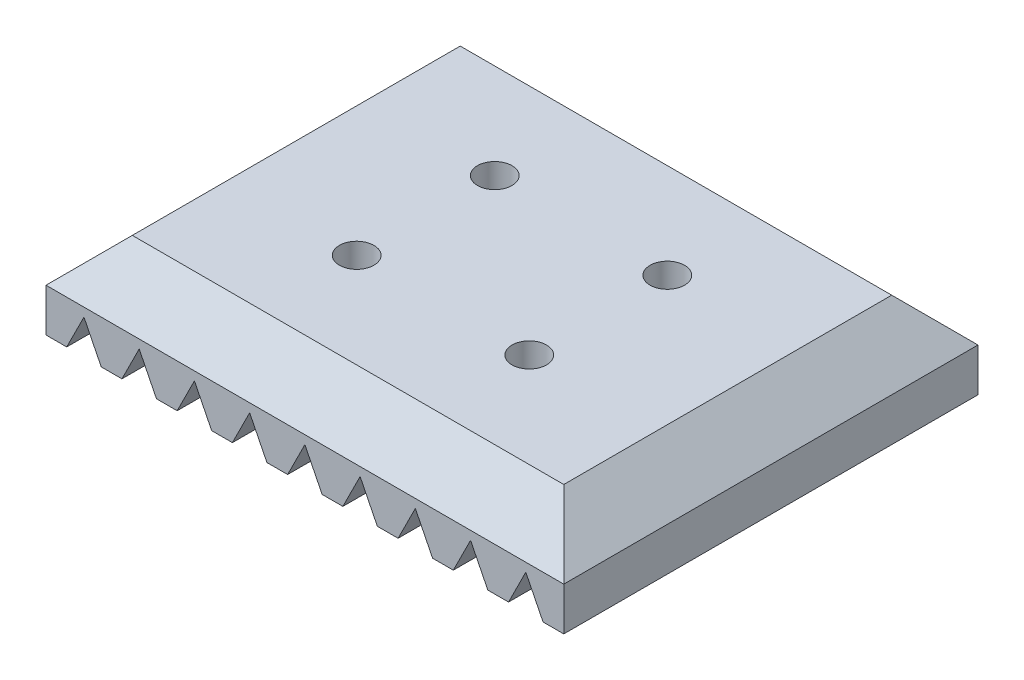
ISO-10303-21;
HEADER;
FILE_DESCRIPTION(('STEP AP214'),'2;1');
FILE_NAME('part.step','',(''),(''),'','','');
FILE_SCHEMA(('AUTOMOTIVE_DESIGN { 1 0 10303 214 1 1 1 1 }'));
ENDSEC;
DATA;
#1=APPLICATION_CONTEXT('core data for automotive mechanical design processes');
#2=APPLICATION_PROTOCOL_DEFINITION('international standard','automotive_design',2000,#1);
#3=PRODUCT_CONTEXT('',#1,'mechanical');
#4=PRODUCT('Part','Part','',(#3));
#5=PRODUCT_RELATED_PRODUCT_CATEGORY('part','',(#4));
#6=PRODUCT_DEFINITION_FORMATION('','',#4);
#7=PRODUCT_DEFINITION_CONTEXT('part definition',#1,'design');
#8=PRODUCT_DEFINITION('design','',#6,#7);
#9=PRODUCT_DEFINITION_SHAPE('','',#8);
#10=(LENGTH_UNIT() NAMED_UNIT(*) SI_UNIT(.MILLI.,.METRE.));
#11=(NAMED_UNIT(*) PLANE_ANGLE_UNIT() SI_UNIT($,.RADIAN.));
#12=(NAMED_UNIT(*) SI_UNIT($,.STERADIAN.) SOLID_ANGLE_UNIT());
#13=UNCERTAINTY_MEASURE_WITH_UNIT(LENGTH_MEASURE(1.E-05),#10,'distance_accuracy_value','');
#14=(GEOMETRIC_REPRESENTATION_CONTEXT(3) GLOBAL_UNCERTAINTY_ASSIGNED_CONTEXT((#13)) GLOBAL_UNIT_ASSIGNED_CONTEXT((#10,
#11,#12)) REPRESENTATION_CONTEXT('',''));
#15=CARTESIAN_POINT('',(0.,0.,0.));
#16=DIRECTION('',(0.,0.,1.));
#17=DIRECTION('',(1.,0.,0.));
#18=AXIS2_PLACEMENT_3D('',#15,#16,#17);
#19=CARTESIAN_POINT('',(0.,12.7,60.96));
#20=DIRECTION('',(0.,0.,-1.));
#21=DIRECTION('',(-1.,0.,0.));
#22=AXIS2_PLACEMENT_3D('',#19,#20,#21);
#23=PLANE('',#22);
#24=DIRECTION('',(0.447213595499958,0.894427190999916,0.));
#25=VECTOR('',#24,1.);
#26=CARTESIAN_POINT('',(68.072,0.,60.96));
#27=LINE('',#26,#25);
#28=CARTESIAN_POINT('',(68.072,0.,60.96));
#29=VERTEX_POINT('',#28);
#30=CARTESIAN_POINT('',(70.612,5.08,60.96));
#31=VERTEX_POINT('',#30);
#32=EDGE_CURVE('E264',#29,#31,#27,.T.);
#33=ORIENTED_EDGE('',*,*,#32,.T.);
#34=DIRECTION('',(0.447213595499958,-0.894427190999916,0.));
#35=VECTOR('',#34,1.);
#36=CARTESIAN_POINT('',(70.612,5.08,60.96));
#37=LINE('',#36,#35);
#38=CARTESIAN_POINT('',(73.152,0.,60.96));
#39=VERTEX_POINT('',#38);
#40=EDGE_CURVE('E251',#31,#39,#37,.T.);
#41=ORIENTED_EDGE('',*,*,#40,.T.);
#42=DIRECTION('',(1.,0.,0.));
#43=VECTOR('',#42,1.);
#44=CARTESIAN_POINT('',(0.,0.,60.96));
#45=LINE('',#44,#43);
#46=CARTESIAN_POINT('',(76.2,0.,60.96));
#47=VERTEX_POINT('',#46);
#48=EDGE_CURVE('E439',#39,#47,#45,.T.);
#49=ORIENTED_EDGE('',*,*,#48,.T.);
#50=DIRECTION('',(0.,-1.,0.));
#51=VECTOR('',#50,1.);
#52=CARTESIAN_POINT('',(76.2,12.7,60.96));
#53=LINE('',#52,#51);
#54=CARTESIAN_POINT('',(76.2,6.34999999999996,60.96));
#55=VERTEX_POINT('',#54);
#56=EDGE_CURVE('E456',#55,#47,#53,.T.);
#57=ORIENTED_EDGE('',*,*,#56,.F.);
#58=DIRECTION('',(-1.,0.,0.));
#59=VECTOR('',#58,1.);
#60=CARTESIAN_POINT('',(0.,6.34999999999996,60.96));
#61=LINE('',#60,#59);
#62=CARTESIAN_POINT('',(0.,6.34999999999996,60.96));
#63=VERTEX_POINT('',#62);
#64=EDGE_CURVE('E11',#55,#63,#61,.T.);
#65=ORIENTED_EDGE('',*,*,#64,.T.);
#66=DIRECTION('',(0.,-1.,0.));
#67=VECTOR('',#66,1.);
#68=CARTESIAN_POINT('',(0.,12.7,60.96));
#69=LINE('',#68,#67);
#70=CARTESIAN_POINT('',(0.,0.,60.96));
#71=VERTEX_POINT('',#70);
#72=EDGE_CURVE('E459',#63,#71,#69,.T.);
#73=ORIENTED_EDGE('',*,*,#72,.T.);
#74=CARTESIAN_POINT('',(3.04800000000001,0.,60.96));
#75=VERTEX_POINT('',#74);
#76=EDGE_CURVE('E440',#71,#75,#45,.T.);
#77=ORIENTED_EDGE('',*,*,#76,.T.);
#78=DIRECTION('',(0.447213595499958,0.894427190999916,0.));
#79=VECTOR('',#78,1.);
#80=CARTESIAN_POINT('',(3.04800000000001,0.,60.96));
#81=LINE('',#80,#79);
#82=CARTESIAN_POINT('',(5.58800000000001,5.08,60.96));
#83=VERTEX_POINT('',#82);
#84=EDGE_CURVE('E422',#75,#83,#81,.T.);
#85=ORIENTED_EDGE('',*,*,#84,.T.);
#86=DIRECTION('',(0.447213595499958,-0.894427190999916,0.));
#87=VECTOR('',#86,1.);
#88=CARTESIAN_POINT('',(5.58800000000001,5.08,60.96));
#89=LINE('',#88,#87);
#90=CARTESIAN_POINT('',(8.12800000000001,0.,60.96));
#91=VERTEX_POINT('',#90);
#92=EDGE_CURVE('E417',#83,#91,#89,.T.);
#93=ORIENTED_EDGE('',*,*,#92,.T.);
#94=CARTESIAN_POINT('',(11.176,0.,60.96));
#95=VERTEX_POINT('',#94);
#96=EDGE_CURVE('E444',#91,#95,#45,.T.);
#97=ORIENTED_EDGE('',*,*,#96,.T.);
#98=DIRECTION('',(0.447213595499958,0.894427190999916,0.));
#99=VECTOR('',#98,1.);
#100=CARTESIAN_POINT('',(11.176,0.,60.96));
#101=LINE('',#100,#99);
#102=CARTESIAN_POINT('',(13.716,5.08,60.96));
#103=VERTEX_POINT('',#102);
#104=EDGE_CURVE('E408',#95,#103,#101,.T.);
#105=ORIENTED_EDGE('',*,*,#104,.T.);
#106=DIRECTION('',(0.447213595499958,-0.894427190999916,0.));
#107=VECTOR('',#106,1.);
#108=CARTESIAN_POINT('',(13.716,5.08,60.96));
#109=LINE('',#108,#107);
#110=CARTESIAN_POINT('',(16.256,0.,60.96));
#111=VERTEX_POINT('',#110);
#112=EDGE_CURVE('E397',#103,#111,#109,.T.);
#113=ORIENTED_EDGE('',*,*,#112,.T.);
#114=CARTESIAN_POINT('',(19.304,0.,60.96));
#115=VERTEX_POINT('',#114);
#116=EDGE_CURVE('E977',#111,#115,#45,.T.);
#117=ORIENTED_EDGE('',*,*,#116,.T.);
#118=DIRECTION('',(0.447213595499958,0.894427190999916,0.));
#119=VECTOR('',#118,1.);
#120=CARTESIAN_POINT('',(19.304,0.,60.96));
#121=LINE('',#120,#119);
#122=CARTESIAN_POINT('',(21.844,5.08,60.96));
#123=VERTEX_POINT('',#122);
#124=EDGE_CURVE('E388',#115,#123,#121,.T.);
#125=ORIENTED_EDGE('',*,*,#124,.T.);
#126=DIRECTION('',(0.447213595499958,-0.894427190999916,0.));
#127=VECTOR('',#126,1.);
#128=CARTESIAN_POINT('',(21.844,5.08,60.96));
#129=LINE('',#128,#127);
#130=CARTESIAN_POINT('',(24.384,0.,60.96));
#131=VERTEX_POINT('',#130);
#132=EDGE_CURVE('E377',#123,#131,#129,.T.);
#133=ORIENTED_EDGE('',*,*,#132,.T.);
#134=CARTESIAN_POINT('',(27.432,0.,60.96));
#135=VERTEX_POINT('',#134);
#136=EDGE_CURVE('E979',#131,#135,#45,.T.);
#137=ORIENTED_EDGE('',*,*,#136,.T.);
#138=DIRECTION('',(0.447213595499958,0.894427190999916,0.));
#139=VECTOR('',#138,1.);
#140=CARTESIAN_POINT('',(27.432,0.,60.96));
#141=LINE('',#140,#139);
#142=CARTESIAN_POINT('',(29.972,5.08,60.96));
#143=VERTEX_POINT('',#142);
#144=EDGE_CURVE('E368',#135,#143,#141,.T.);
#145=ORIENTED_EDGE('',*,*,#144,.T.);
#146=DIRECTION('',(0.447213595499958,-0.894427190999916,0.));
#147=VECTOR('',#146,1.);
#148=CARTESIAN_POINT('',(29.972,5.08,60.96));
#149=LINE('',#148,#147);
#150=CARTESIAN_POINT('',(32.512,0.,60.96));
#151=VERTEX_POINT('',#150);
#152=EDGE_CURVE('E357',#143,#151,#149,.T.);
#153=ORIENTED_EDGE('',*,*,#152,.T.);
#154=CARTESIAN_POINT('',(35.56,0.,60.96));
#155=VERTEX_POINT('',#154);
#156=EDGE_CURVE('E982',#151,#155,#45,.T.);
#157=ORIENTED_EDGE('',*,*,#156,.T.);
#158=DIRECTION('',(0.447213595499958,0.894427190999916,0.));
#159=VECTOR('',#158,1.);
#160=CARTESIAN_POINT('',(35.56,0.,60.96));
#161=LINE('',#160,#159);
#162=CARTESIAN_POINT('',(38.1,5.08,60.96));
#163=VERTEX_POINT('',#162);
#164=EDGE_CURVE('E348',#155,#163,#161,.T.);
#165=ORIENTED_EDGE('',*,*,#164,.T.);
#166=DIRECTION('',(0.447213595499958,-0.894427190999916,0.));
#167=VECTOR('',#166,1.);
#168=CARTESIAN_POINT('',(38.1,5.08,60.96));
#169=LINE('',#168,#167);
#170=CARTESIAN_POINT('',(40.64,0.,60.96));
#171=VERTEX_POINT('',#170);
#172=EDGE_CURVE('E337',#163,#171,#169,.T.);
#173=ORIENTED_EDGE('',*,*,#172,.T.);
#174=CARTESIAN_POINT('',(43.688,0.,60.96));
#175=VERTEX_POINT('',#174);
#176=EDGE_CURVE('E542',#171,#175,#45,.T.);
#177=ORIENTED_EDGE('',*,*,#176,.T.);
#178=DIRECTION('',(0.447213595499958,0.894427190999916,0.));
#179=VECTOR('',#178,1.);
#180=CARTESIAN_POINT('',(43.688,0.,60.96));
#181=LINE('',#180,#179);
#182=CARTESIAN_POINT('',(46.228,5.08,60.96));
#183=VERTEX_POINT('',#182);
#184=EDGE_CURVE('E328',#175,#183,#181,.T.);
#185=ORIENTED_EDGE('',*,*,#184,.T.);
#186=DIRECTION('',(0.447213595499958,-0.894427190999916,0.));
#187=VECTOR('',#186,1.);
#188=CARTESIAN_POINT('',(46.228,5.08,60.96));
#189=LINE('',#188,#187);
#190=CARTESIAN_POINT('',(48.768,0.,60.96));
#191=VERTEX_POINT('',#190);
#192=EDGE_CURVE('E317',#183,#191,#189,.T.);
#193=ORIENTED_EDGE('',*,*,#192,.T.);
#194=CARTESIAN_POINT('',(51.816,0.,60.96));
#195=VERTEX_POINT('',#194);
#196=EDGE_CURVE('E540',#191,#195,#45,.T.);
#197=ORIENTED_EDGE('',*,*,#196,.T.);
#198=DIRECTION('',(0.447213595499958,0.894427190999916,0.));
#199=VECTOR('',#198,1.);
#200=CARTESIAN_POINT('',(51.816,0.,60.96));
#201=LINE('',#200,#199);
#202=CARTESIAN_POINT('',(54.356,5.08,60.96));
#203=VERTEX_POINT('',#202);
#204=EDGE_CURVE('E308',#195,#203,#201,.T.);
#205=ORIENTED_EDGE('',*,*,#204,.T.);
#206=DIRECTION('',(0.447213595499958,-0.894427190999916,0.));
#207=VECTOR('',#206,1.);
#208=CARTESIAN_POINT('',(54.356,5.08,60.96));
#209=LINE('',#208,#207);
#210=CARTESIAN_POINT('',(56.896,0.,60.96));
#211=VERTEX_POINT('',#210);
#212=EDGE_CURVE('E297',#203,#211,#209,.T.);
#213=ORIENTED_EDGE('',*,*,#212,.T.);
#214=CARTESIAN_POINT('',(59.944,0.,60.96));
#215=VERTEX_POINT('',#214);
#216=EDGE_CURVE('E539',#211,#215,#45,.T.);
#217=ORIENTED_EDGE('',*,*,#216,.T.);
#218=DIRECTION('',(0.447213595499958,0.894427190999916,0.));
#219=VECTOR('',#218,1.);
#220=CARTESIAN_POINT('',(59.944,0.,60.96));
#221=LINE('',#220,#219);
#222=CARTESIAN_POINT('',(62.484,5.08,60.96));
#223=VERTEX_POINT('',#222);
#224=EDGE_CURVE('E288',#215,#223,#221,.T.);
#225=ORIENTED_EDGE('',*,*,#224,.T.);
#226=DIRECTION('',(0.447213595499958,-0.894427190999916,0.));
#227=VECTOR('',#226,1.);
#228=CARTESIAN_POINT('',(62.484,5.08,60.96));
#229=LINE('',#228,#227);
#230=CARTESIAN_POINT('',(65.024,0.,60.96));
#231=VERTEX_POINT('',#230);
#232=EDGE_CURVE('E279',#223,#231,#229,.T.);
#233=ORIENTED_EDGE('',*,*,#232,.T.);
#234=EDGE_CURVE('E271',#231,#29,#45,.T.);
#235=ORIENTED_EDGE('',*,*,#234,.T.);
#236=EDGE_LOOP('',(#33,#41,#49,#57,#65,#73,#77,#85,#93,#97,#105,#113,#117,#125,#133,#137,#145,
#153,#157,#165,#173,#177,#185,#193,#197,#205,#213,#217,#225,#233,#235));
#237=FACE_BOUND('',#236,.T.);
#238=ADVANCED_FACE('F35',(#237),#23,.F.);
#239=CARTESIAN_POINT('',(0.,12.7,0.));
#240=DIRECTION('',(0.,0.,1.));
#241=DIRECTION('',(1.,0.,0.));
#242=AXIS2_PLACEMENT_3D('',#239,#240,#241);
#243=PLANE('',#242);
#244=DIRECTION('',(0.447213595499958,0.894427190999916,0.));
#245=VECTOR('',#244,1.);
#246=CARTESIAN_POINT('',(68.072,0.,0.));
#247=LINE('',#246,#245);
#248=CARTESIAN_POINT('',(68.072,0.,0.));
#249=VERTEX_POINT('',#248);
#250=CARTESIAN_POINT('',(70.612,5.08,0.));
#251=VERTEX_POINT('',#250);
#252=EDGE_CURVE('E266',#249,#251,#247,.T.);
#253=ORIENTED_EDGE('',*,*,#252,.F.);
#254=DIRECTION('',(-1.,0.,0.));
#255=VECTOR('',#254,1.);
#256=CARTESIAN_POINT('',(0.,0.,0.));
#257=LINE('',#256,#255);
#258=CARTESIAN_POINT('',(65.024,0.,0.));
#259=VERTEX_POINT('',#258);
#260=EDGE_CURVE('E60',#249,#259,#257,.T.);
#261=ORIENTED_EDGE('',*,*,#260,.T.);
#262=DIRECTION('',(0.447213595499958,-0.894427190999916,0.));
#263=VECTOR('',#262,1.);
#264=CARTESIAN_POINT('',(62.484,5.08,0.));
#265=LINE('',#264,#263);
#266=CARTESIAN_POINT('',(62.484,5.08,0.));
#267=VERTEX_POINT('',#266);
#268=EDGE_CURVE('E284',#267,#259,#265,.T.);
#269=ORIENTED_EDGE('',*,*,#268,.F.);
#270=DIRECTION('',(0.447213595499958,0.894427190999916,0.));
#271=VECTOR('',#270,1.);
#272=CARTESIAN_POINT('',(59.944,0.,0.));
#273=LINE('',#272,#271);
#274=CARTESIAN_POINT('',(59.944,0.,0.));
#275=VERTEX_POINT('',#274);
#276=EDGE_CURVE('E294',#275,#267,#273,.T.);
#277=ORIENTED_EDGE('',*,*,#276,.F.);
#278=CARTESIAN_POINT('',(56.896,0.,0.));
#279=VERTEX_POINT('',#278);
#280=EDGE_CURVE('E525',#275,#279,#257,.T.);
#281=ORIENTED_EDGE('',*,*,#280,.T.);
#282=DIRECTION('',(0.447213595499958,-0.894427190999916,0.));
#283=VECTOR('',#282,1.);
#284=CARTESIAN_POINT('',(54.356,5.08,0.));
#285=LINE('',#284,#283);
#286=CARTESIAN_POINT('',(54.356,5.08,0.));
#287=VERTEX_POINT('',#286);
#288=EDGE_CURVE('E303',#287,#279,#285,.T.);
#289=ORIENTED_EDGE('',*,*,#288,.F.);
#290=DIRECTION('',(0.447213595499958,0.894427190999916,0.));
#291=VECTOR('',#290,1.);
#292=CARTESIAN_POINT('',(51.816,0.,0.));
#293=LINE('',#292,#291);
#294=CARTESIAN_POINT('',(51.816,0.,0.));
#295=VERTEX_POINT('',#294);
#296=EDGE_CURVE('E314',#295,#287,#293,.T.);
#297=ORIENTED_EDGE('',*,*,#296,.F.);
#298=CARTESIAN_POINT('',(48.768,0.,0.));
#299=VERTEX_POINT('',#298);
#300=EDGE_CURVE('E521',#295,#299,#257,.T.);
#301=ORIENTED_EDGE('',*,*,#300,.T.);
#302=DIRECTION('',(0.447213595499958,-0.894427190999916,0.));
#303=VECTOR('',#302,1.);
#304=CARTESIAN_POINT('',(46.228,5.08,0.));
#305=LINE('',#304,#303);
#306=CARTESIAN_POINT('',(46.228,5.08,0.));
#307=VERTEX_POINT('',#306);
#308=EDGE_CURVE('E323',#307,#299,#305,.T.);
#309=ORIENTED_EDGE('',*,*,#308,.F.);
#310=DIRECTION('',(0.447213595499958,0.894427190999916,0.));
#311=VECTOR('',#310,1.);
#312=CARTESIAN_POINT('',(43.688,0.,0.));
#313=LINE('',#312,#311);
#314=CARTESIAN_POINT('',(43.688,0.,0.));
#315=VERTEX_POINT('',#314);
#316=EDGE_CURVE('E334',#315,#307,#313,.T.);
#317=ORIENTED_EDGE('',*,*,#316,.F.);
#318=CARTESIAN_POINT('',(40.64,0.,0.));
#319=VERTEX_POINT('',#318);
#320=EDGE_CURVE('E517',#315,#319,#257,.T.);
#321=ORIENTED_EDGE('',*,*,#320,.T.);
#322=DIRECTION('',(0.447213595499958,-0.894427190999916,0.));
#323=VECTOR('',#322,1.);
#324=CARTESIAN_POINT('',(38.1,5.08,0.));
#325=LINE('',#324,#323);
#326=CARTESIAN_POINT('',(38.1,5.08,0.));
#327=VERTEX_POINT('',#326);
#328=EDGE_CURVE('E343',#327,#319,#325,.T.);
#329=ORIENTED_EDGE('',*,*,#328,.F.);
#330=DIRECTION('',(0.447213595499958,0.894427190999916,0.));
#331=VECTOR('',#330,1.);
#332=CARTESIAN_POINT('',(35.56,0.,0.));
#333=LINE('',#332,#331);
#334=CARTESIAN_POINT('',(35.56,0.,0.));
#335=VERTEX_POINT('',#334);
#336=EDGE_CURVE('E354',#335,#327,#333,.T.);
#337=ORIENTED_EDGE('',*,*,#336,.F.);
#338=CARTESIAN_POINT('',(32.512,0.,0.));
#339=VERTEX_POINT('',#338);
#340=EDGE_CURVE('E513',#335,#339,#257,.T.);
#341=ORIENTED_EDGE('',*,*,#340,.T.);
#342=DIRECTION('',(0.447213595499958,-0.894427190999916,0.));
#343=VECTOR('',#342,1.);
#344=CARTESIAN_POINT('',(29.972,5.08,0.));
#345=LINE('',#344,#343);
#346=CARTESIAN_POINT('',(29.972,5.08,0.));
#347=VERTEX_POINT('',#346);
#348=EDGE_CURVE('E363',#347,#339,#345,.T.);
#349=ORIENTED_EDGE('',*,*,#348,.F.);
#350=DIRECTION('',(0.447213595499958,0.894427190999916,0.));
#351=VECTOR('',#350,1.);
#352=CARTESIAN_POINT('',(27.432,0.,0.));
#353=LINE('',#352,#351);
#354=CARTESIAN_POINT('',(27.432,0.,0.));
#355=VERTEX_POINT('',#354);
#356=EDGE_CURVE('E374',#355,#347,#353,.T.);
#357=ORIENTED_EDGE('',*,*,#356,.F.);
#358=CARTESIAN_POINT('',(24.384,0.,0.));
#359=VERTEX_POINT('',#358);
#360=EDGE_CURVE('E509',#355,#359,#257,.T.);
#361=ORIENTED_EDGE('',*,*,#360,.T.);
#362=DIRECTION('',(0.447213595499958,-0.894427190999916,0.));
#363=VECTOR('',#362,1.);
#364=CARTESIAN_POINT('',(21.844,5.08,0.));
#365=LINE('',#364,#363);
#366=CARTESIAN_POINT('',(21.844,5.08,0.));
#367=VERTEX_POINT('',#366);
#368=EDGE_CURVE('E383',#367,#359,#365,.T.);
#369=ORIENTED_EDGE('',*,*,#368,.F.);
#370=DIRECTION('',(0.447213595499958,0.894427190999916,0.));
#371=VECTOR('',#370,1.);
#372=CARTESIAN_POINT('',(19.304,0.,0.));
#373=LINE('',#372,#371);
#374=CARTESIAN_POINT('',(19.304,0.,0.));
#375=VERTEX_POINT('',#374);
#376=EDGE_CURVE('E394',#375,#367,#373,.T.);
#377=ORIENTED_EDGE('',*,*,#376,.F.);
#378=CARTESIAN_POINT('',(16.256,0.,0.));
#379=VERTEX_POINT('',#378);
#380=EDGE_CURVE('E506',#375,#379,#257,.T.);
#381=ORIENTED_EDGE('',*,*,#380,.T.);
#382=DIRECTION('',(0.447213595499958,-0.894427190999916,0.));
#383=VECTOR('',#382,1.);
#384=CARTESIAN_POINT('',(13.716,5.08,0.));
#385=LINE('',#384,#383);
#386=CARTESIAN_POINT('',(13.716,5.08,0.));
#387=VERTEX_POINT('',#386);
#388=EDGE_CURVE('E403',#387,#379,#385,.T.);
#389=ORIENTED_EDGE('',*,*,#388,.F.);
#390=DIRECTION('',(0.447213595499958,0.894427190999916,0.));
#391=VECTOR('',#390,1.);
#392=CARTESIAN_POINT('',(11.176,0.,0.));
#393=LINE('',#392,#391);
#394=CARTESIAN_POINT('',(11.176,0.,0.));
#395=VERTEX_POINT('',#394);
#396=EDGE_CURVE('E414',#395,#387,#393,.T.);
#397=ORIENTED_EDGE('',*,*,#396,.F.);
#398=CARTESIAN_POINT('',(8.128,0.,0.));
#399=VERTEX_POINT('',#398);
#400=EDGE_CURVE('E505',#395,#399,#257,.T.);
#401=ORIENTED_EDGE('',*,*,#400,.T.);
#402=DIRECTION('',(0.447213595499958,-0.894427190999916,0.));
#403=VECTOR('',#402,1.);
#404=CARTESIAN_POINT('',(5.58800000000001,5.08,0.));
#405=LINE('',#404,#403);
#406=CARTESIAN_POINT('',(5.58800000000001,5.08,0.));
#407=VERTEX_POINT('',#406);
#408=EDGE_CURVE('E418',#407,#399,#405,.T.);
#409=ORIENTED_EDGE('',*,*,#408,.F.);
#410=DIRECTION('',(0.447213595499958,0.894427190999916,0.));
#411=VECTOR('',#410,1.);
#412=CARTESIAN_POINT('',(3.04800000000001,0.,0.));
#413=LINE('',#412,#411);
#414=CARTESIAN_POINT('',(3.04800000000001,0.,0.));
#415=VERTEX_POINT('',#414);
#416=EDGE_CURVE('E421',#415,#407,#413,.T.);
#417=ORIENTED_EDGE('',*,*,#416,.F.);
#418=CARTESIAN_POINT('',(0.,0.,0.));
#419=VERTEX_POINT('',#418);
#420=EDGE_CURVE('E447',#415,#419,#257,.T.);
#421=ORIENTED_EDGE('',*,*,#420,.T.);
#422=DIRECTION('',(0.,-1.,0.));
#423=VECTOR('',#422,1.);
#424=CARTESIAN_POINT('',(0.,12.7,0.));
#425=LINE('',#424,#423);
#426=CARTESIAN_POINT('',(0.,6.34999999999996,0.));
#427=VERTEX_POINT('',#426);
#428=EDGE_CURVE('E451',#427,#419,#425,.T.);
#429=ORIENTED_EDGE('',*,*,#428,.F.);
#430=DIRECTION('',(1.,0.,0.));
#431=VECTOR('',#430,1.);
#432=CARTESIAN_POINT('',(76.2,6.34999999999996,0.));
#433=LINE('',#432,#431);
#434=CARTESIAN_POINT('',(76.2,6.34999999999996,0.));
#435=VERTEX_POINT('',#434);
#436=EDGE_CURVE('E473',#427,#435,#433,.T.);
#437=ORIENTED_EDGE('',*,*,#436,.T.);
#438=DIRECTION('',(0.,-1.,0.));
#439=VECTOR('',#438,1.);
#440=CARTESIAN_POINT('',(76.2,12.7,0.));
#441=LINE('',#440,#439);
#442=CARTESIAN_POINT('',(76.2,0.,0.));
#443=VERTEX_POINT('',#442);
#444=EDGE_CURVE('E454',#435,#443,#441,.T.);
#445=ORIENTED_EDGE('',*,*,#444,.T.);
#446=CARTESIAN_POINT('',(73.152,0.,0.));
#447=VERTEX_POINT('',#446);
#448=EDGE_CURVE('E448',#443,#447,#257,.T.);
#449=ORIENTED_EDGE('',*,*,#448,.T.);
#450=DIRECTION('',(0.447213595499958,-0.894427190999916,0.));
#451=VECTOR('',#450,1.);
#452=CARTESIAN_POINT('',(70.612,5.08,0.));
#453=LINE('',#452,#451);
#454=EDGE_CURVE('E52',#251,#447,#453,.T.);
#455=ORIENTED_EDGE('',*,*,#454,.F.);
#456=EDGE_LOOP('',(#253,#261,#269,#277,#281,#289,#297,#301,#309,#317,#321,#329,#337,#341,#349,
#357,#361,#369,#377,#381,#389,#397,#401,#409,#417,#421,#429,#437,#445,#449,#455));
#457=FACE_BOUND('',#456,.T.);
#458=ADVANCED_FACE('F499',(#457),#243,.F.);
#459=CARTESIAN_POINT('',(0.,0.,0.));
#460=DIRECTION('',(0.,1.,0.));
#461=DIRECTION('',(0.,0.,1.));
#462=AXIS2_PLACEMENT_3D('',#459,#460,#461);
#463=PLANE('',#462);
#464=DIRECTION('',(0.,0.,1.));
#465=VECTOR('',#464,1.);
#466=CARTESIAN_POINT('',(68.072,0.,0.));
#467=LINE('',#466,#465);
#468=EDGE_CURVE('E272',#249,#29,#467,.T.);
#469=ORIENTED_EDGE('',*,*,#468,.T.);
#470=ORIENTED_EDGE('',*,*,#234,.F.);
#471=DIRECTION('',(0.,0.,1.));
#472=VECTOR('',#471,1.);
#473=CARTESIAN_POINT('',(65.024,0.,0.));
#474=LINE('',#473,#472);
#475=EDGE_CURVE('E286',#259,#231,#474,.T.);
#476=ORIENTED_EDGE('',*,*,#475,.F.);
#477=ORIENTED_EDGE('',*,*,#260,.F.);
#478=EDGE_LOOP('',(#469,#470,#476,#477));
#479=FACE_BOUND('',#478,.T.);
#480=ADVANCED_FACE('F575',(#479),#463,.F.);
#481=DIRECTION('',(0.,0.,1.));
#482=VECTOR('',#481,1.);
#483=CARTESIAN_POINT('',(73.152,0.,0.));
#484=LINE('',#483,#482);
#485=EDGE_CURVE('E256',#447,#39,#484,.T.);
#486=ORIENTED_EDGE('',*,*,#485,.F.);
#487=ORIENTED_EDGE('',*,*,#448,.F.);
#488=DIRECTION('',(0.,0.,-1.));
#489=VECTOR('',#488,1.);
#490=CARTESIAN_POINT('',(76.2,0.,0.));
#491=LINE('',#490,#489);
#492=EDGE_CURVE('E443',#47,#443,#491,.T.);
#493=ORIENTED_EDGE('',*,*,#492,.F.);
#494=ORIENTED_EDGE('',*,*,#48,.F.);
#495=EDGE_LOOP('',(#486,#487,#493,#494));
#496=FACE_BOUND('',#495,.T.);
#497=ADVANCED_FACE('F550',(#496),#463,.F.);
#498=DIRECTION('',(0.,0.,1.));
#499=VECTOR('',#498,1.);
#500=CARTESIAN_POINT('',(59.944,0.,0.));
#501=LINE('',#500,#499);
#502=EDGE_CURVE('E291',#275,#215,#501,.T.);
#503=ORIENTED_EDGE('',*,*,#502,.T.);
#504=ORIENTED_EDGE('',*,*,#216,.F.);
#505=DIRECTION('',(0.,0.,1.));
#506=VECTOR('',#505,1.);
#507=CARTESIAN_POINT('',(56.896,0.,0.));
#508=LINE('',#507,#506);
#509=EDGE_CURVE('E306',#279,#211,#508,.T.);
#510=ORIENTED_EDGE('',*,*,#509,.F.);
#511=ORIENTED_EDGE('',*,*,#280,.F.);
#512=EDGE_LOOP('',(#503,#504,#510,#511));
#513=FACE_BOUND('',#512,.T.);
#514=ADVANCED_FACE('F537',(#513),#463,.F.);
#515=DIRECTION('',(0.,0.,1.));
#516=VECTOR('',#515,1.);
#517=CARTESIAN_POINT('',(51.816,0.,0.));
#518=LINE('',#517,#516);
#519=EDGE_CURVE('E311',#295,#195,#518,.T.);
#520=ORIENTED_EDGE('',*,*,#519,.T.);
#521=ORIENTED_EDGE('',*,*,#196,.F.);
#522=DIRECTION('',(0.,0.,1.));
#523=VECTOR('',#522,1.);
#524=CARTESIAN_POINT('',(48.768,0.,0.));
#525=LINE('',#524,#523);
#526=EDGE_CURVE('E326',#299,#191,#525,.T.);
#527=ORIENTED_EDGE('',*,*,#526,.F.);
#528=ORIENTED_EDGE('',*,*,#300,.F.);
#529=EDGE_LOOP('',(#520,#521,#527,#528));
#530=FACE_BOUND('',#529,.T.);
#531=ADVANCED_FACE('F878',(#530),#463,.F.);
#532=DIRECTION('',(0.,0.,1.));
#533=VECTOR('',#532,1.);
#534=CARTESIAN_POINT('',(43.688,0.,0.));
#535=LINE('',#534,#533);
#536=EDGE_CURVE('E331',#315,#175,#535,.T.);
#537=ORIENTED_EDGE('',*,*,#536,.T.);
#538=ORIENTED_EDGE('',*,*,#176,.F.);
#539=DIRECTION('',(0.,0.,1.));
#540=VECTOR('',#539,1.);
#541=CARTESIAN_POINT('',(40.64,0.,0.));
#542=LINE('',#541,#540);
#543=EDGE_CURVE('E346',#319,#171,#542,.T.);
#544=ORIENTED_EDGE('',*,*,#543,.F.);
#545=ORIENTED_EDGE('',*,*,#320,.F.);
#546=EDGE_LOOP('',(#537,#538,#544,#545));
#547=FACE_BOUND('',#546,.T.);
#548=ADVANCED_FACE('F885',(#547),#463,.F.);
#549=DIRECTION('',(0.,0.,1.));
#550=VECTOR('',#549,1.);
#551=CARTESIAN_POINT('',(35.56,0.,0.));
#552=LINE('',#551,#550);
#553=EDGE_CURVE('E351',#335,#155,#552,.T.);
#554=ORIENTED_EDGE('',*,*,#553,.T.);
#555=ORIENTED_EDGE('',*,*,#156,.F.);
#556=DIRECTION('',(0.,0.,1.));
#557=VECTOR('',#556,1.);
#558=CARTESIAN_POINT('',(32.512,0.,0.));
#559=LINE('',#558,#557);
#560=EDGE_CURVE('E366',#339,#151,#559,.T.);
#561=ORIENTED_EDGE('',*,*,#560,.F.);
#562=ORIENTED_EDGE('',*,*,#340,.F.);
#563=EDGE_LOOP('',(#554,#555,#561,#562));
#564=FACE_BOUND('',#563,.T.);
#565=ADVANCED_FACE('F893',(#564),#463,.F.);
#566=DIRECTION('',(0.,0.,1.));
#567=VECTOR('',#566,1.);
#568=CARTESIAN_POINT('',(27.432,0.,0.));
#569=LINE('',#568,#567);
#570=EDGE_CURVE('E371',#355,#135,#569,.T.);
#571=ORIENTED_EDGE('',*,*,#570,.T.);
#572=ORIENTED_EDGE('',*,*,#136,.F.);
#573=DIRECTION('',(0.,0.,1.));
#574=VECTOR('',#573,1.);
#575=CARTESIAN_POINT('',(24.384,0.,0.));
#576=LINE('',#575,#574);
#577=EDGE_CURVE('E386',#359,#131,#576,.T.);
#578=ORIENTED_EDGE('',*,*,#577,.F.);
#579=ORIENTED_EDGE('',*,*,#360,.F.);
#580=EDGE_LOOP('',(#571,#572,#578,#579));
#581=FACE_BOUND('',#580,.T.);
#582=ADVANCED_FACE('F901',(#581),#463,.F.);
#583=DIRECTION('',(0.,0.,1.));
#584=VECTOR('',#583,1.);
#585=CARTESIAN_POINT('',(19.304,0.,0.));
#586=LINE('',#585,#584);
#587=EDGE_CURVE('E391',#375,#115,#586,.T.);
#588=ORIENTED_EDGE('',*,*,#587,.T.);
#589=ORIENTED_EDGE('',*,*,#116,.F.);
#590=DIRECTION('',(0.,0.,1.));
#591=VECTOR('',#590,1.);
#592=CARTESIAN_POINT('',(16.256,0.,0.));
#593=LINE('',#592,#591);
#594=EDGE_CURVE('E406',#379,#111,#593,.T.);
#595=ORIENTED_EDGE('',*,*,#594,.F.);
#596=ORIENTED_EDGE('',*,*,#380,.F.);
#597=EDGE_LOOP('',(#588,#589,#595,#596));
#598=FACE_BOUND('',#597,.T.);
#599=ADVANCED_FACE('F909',(#598),#463,.F.);
#600=DIRECTION('',(0.,0.,1.));
#601=VECTOR('',#600,1.);
#602=CARTESIAN_POINT('',(11.176,0.,0.));
#603=LINE('',#602,#601);
#604=EDGE_CURVE('E411',#395,#95,#603,.T.);
#605=ORIENTED_EDGE('',*,*,#604,.T.);
#606=ORIENTED_EDGE('',*,*,#96,.F.);
#607=DIRECTION('',(0.,0.,1.));
#608=VECTOR('',#607,1.);
#609=CARTESIAN_POINT('',(8.12800000000001,0.,0.));
#610=LINE('',#609,#608);
#611=EDGE_CURVE('E424',#399,#91,#610,.T.);
#612=ORIENTED_EDGE('',*,*,#611,.F.);
#613=ORIENTED_EDGE('',*,*,#400,.F.);
#614=EDGE_LOOP('',(#605,#606,#612,#613));
#615=FACE_BOUND('',#614,.T.);
#616=ADVANCED_FACE('F917',(#615),#463,.F.);
#617=DIRECTION('',(0.,0.,1.));
#618=VECTOR('',#617,1.);
#619=CARTESIAN_POINT('',(3.04800000000001,0.,0.));
#620=LINE('',#619,#618);
#621=EDGE_CURVE('E429',#415,#75,#620,.T.);
#622=ORIENTED_EDGE('',*,*,#621,.T.);
#623=ORIENTED_EDGE('',*,*,#76,.F.);
#624=DIRECTION('',(0.,0.,1.));
#625=VECTOR('',#624,1.);
#626=CARTESIAN_POINT('',(0.,0.,0.));
#627=LINE('',#626,#625);
#628=EDGE_CURVE('E436',#419,#71,#627,.T.);
#629=ORIENTED_EDGE('',*,*,#628,.F.);
#630=ORIENTED_EDGE('',*,*,#420,.F.);
#631=EDGE_LOOP('',(#622,#623,#629,#630));
#632=FACE_BOUND('',#631,.T.);
#633=ADVANCED_FACE('F580',(#632),#463,.F.);
#634=CARTESIAN_POINT('',(0.,12.7,0.));
#635=DIRECTION('',(1.,0.,0.));
#636=DIRECTION('',(0.,0.,-1.));
#637=AXIS2_PLACEMENT_3D('',#634,#635,#636);
#638=PLANE('',#637);
#639=ORIENTED_EDGE('',*,*,#72,.F.);
#640=DIRECTION('',(0.,0.,-1.));
#641=VECTOR('',#640,1.);
#642=CARTESIAN_POINT('',(0.,6.34999999999996,0.));
#643=LINE('',#642,#641);
#644=EDGE_CURVE('E44',#63,#427,#643,.T.);
#645=ORIENTED_EDGE('',*,*,#644,.T.);
#646=ORIENTED_EDGE('',*,*,#428,.T.);
#647=ORIENTED_EDGE('',*,*,#628,.T.);
#648=EDGE_LOOP('',(#639,#645,#646,#647));
#649=FACE_BOUND('',#648,.T.);
#650=ADVANCED_FACE('F497',(#649),#638,.F.);
#651=CARTESIAN_POINT('',(76.2,12.7,0.));
#652=DIRECTION('',(-1.,0.,0.));
#653=DIRECTION('',(0.,0.,1.));
#654=AXIS2_PLACEMENT_3D('',#651,#652,#653);
#655=PLANE('',#654);
#656=ORIENTED_EDGE('',*,*,#444,.F.);
#657=DIRECTION('',(0.,0.,1.));
#658=VECTOR('',#657,1.);
#659=CARTESIAN_POINT('',(76.2,6.34999999999996,60.96));
#660=LINE('',#659,#658);
#661=EDGE_CURVE('E470',#435,#55,#660,.T.);
#662=ORIENTED_EDGE('',*,*,#661,.T.);
#663=ORIENTED_EDGE('',*,*,#56,.T.);
#664=ORIENTED_EDGE('',*,*,#492,.T.);
#665=EDGE_LOOP('',(#656,#662,#663,#664));
#666=FACE_BOUND('',#665,.T.);
#667=ADVANCED_FACE('F547',(#666),#655,.F.);
#668=CARTESIAN_POINT('',(0.,12.7,0.));
#669=DIRECTION('',(0.,1.,0.));
#670=DIRECTION('',(0.,0.,1.));
#671=AXIS2_PLACEMENT_3D('',#668,#669,#670);
#672=PLANE('',#671);
#673=CARTESIAN_POINT('',(50.8,12.7,40.64));
#674=DIRECTION('',(0.,1.,0.));
#675=DIRECTION('',(0.,0.,1.));
#676=AXIS2_PLACEMENT_3D('',#673,#674,#675);
#677=CIRCLE('',#676,2.54);
#678=CARTESIAN_POINT('',(50.8,12.7,43.18));
#679=VERTEX_POINT('',#678);
#680=EDGE_CURVE('E999',#679,#679,#677,.T.);
#681=ORIENTED_EDGE('',*,*,#680,.F.);
#682=EDGE_LOOP('',(#681));
#683=FACE_BOUND('',#682,.T.);
#684=CARTESIAN_POINT('',(25.4,12.7,40.64));
#685=DIRECTION('',(0.,1.,0.));
#686=DIRECTION('',(0.,0.,1.));
#687=AXIS2_PLACEMENT_3D('',#684,#685,#686);
#688=CIRCLE('',#687,2.54);
#689=CARTESIAN_POINT('',(25.4,12.7,43.18));
#690=VERTEX_POINT('',#689);
#691=EDGE_CURVE('E998',#690,#690,#688,.T.);
#692=ORIENTED_EDGE('',*,*,#691,.F.);
#693=EDGE_LOOP('',(#692));
#694=FACE_BOUND('',#693,.T.);
#695=CARTESIAN_POINT('',(50.8,12.7,20.32));
#696=DIRECTION('',(0.,1.,0.));
#697=DIRECTION('',(0.,0.,1.));
#698=AXIS2_PLACEMENT_3D('',#695,#696,#697);
#699=CIRCLE('',#698,2.54);
#700=CARTESIAN_POINT('',(50.8,12.7,22.86));
#701=VERTEX_POINT('',#700);
#702=EDGE_CURVE('E1008',#701,#701,#699,.T.);
#703=ORIENTED_EDGE('',*,*,#702,.F.);
#704=EDGE_LOOP('',(#703));
#705=FACE_BOUND('',#704,.T.);
#706=CARTESIAN_POINT('',(25.4,12.7,20.32));
#707=DIRECTION('',(0.,1.,0.));
#708=DIRECTION('',(0.,0.,1.));
#709=AXIS2_PLACEMENT_3D('',#706,#707,#708);
#710=CIRCLE('',#709,2.54);
#711=CARTESIAN_POINT('',(25.4,12.7,22.86));
#712=VERTEX_POINT('',#711);
#713=EDGE_CURVE('E1013',#712,#712,#710,.T.);
#714=ORIENTED_EDGE('',*,*,#713,.F.);
#715=EDGE_LOOP('',(#714));
#716=FACE_BOUND('',#715,.T.);
#717=DIRECTION('',(1.,0.,0.));
#718=VECTOR('',#717,1.);
#719=CARTESIAN_POINT('',(76.2,12.7,54.61));
#720=LINE('',#719,#718);
#721=CARTESIAN_POINT('',(6.35,12.7,54.61));
#722=VERTEX_POINT('',#721);
#723=CARTESIAN_POINT('',(69.85,12.7,54.61));
#724=VERTEX_POINT('',#723);
#725=EDGE_CURVE('E461',#722,#724,#720,.T.);
#726=ORIENTED_EDGE('',*,*,#725,.T.);
#727=DIRECTION('',(0.,0.,-1.));
#728=VECTOR('',#727,1.);
#729=CARTESIAN_POINT('',(69.85,12.7,0.));
#730=LINE('',#729,#728);
#731=CARTESIAN_POINT('',(69.85,12.7,6.34999999999999));
#732=VERTEX_POINT('',#731);
#733=EDGE_CURVE('E467',#724,#732,#730,.T.);
#734=ORIENTED_EDGE('',*,*,#733,.T.);
#735=DIRECTION('',(-1.,0.,0.));
#736=VECTOR('',#735,1.);
#737=CARTESIAN_POINT('',(0.,12.7,6.34999999999999));
#738=LINE('',#737,#736);
#739=CARTESIAN_POINT('',(6.35,12.7,6.34999999999999));
#740=VERTEX_POINT('',#739);
#741=EDGE_CURVE('E465',#732,#740,#738,.T.);
#742=ORIENTED_EDGE('',*,*,#741,.T.);
#743=DIRECTION('',(0.,0.,1.));
#744=VECTOR('',#743,1.);
#745=CARTESIAN_POINT('',(6.35,12.7,60.96));
#746=LINE('',#745,#744);
#747=EDGE_CURVE('E463',#740,#722,#746,.T.);
#748=ORIENTED_EDGE('',*,*,#747,.T.);
#749=EDGE_LOOP('',(#726,#734,#742,#748));
#750=FACE_BOUND('',#749,.T.);
#751=ADVANCED_FACE('F557',(#683,#694,#705,#716,#750),#672,.T.);
#752=CARTESIAN_POINT('',(6.34999999999999,12.7,0.));
#753=DIRECTION('',(-0.70710678118655,0.707106781186545,0.));
#754=DIRECTION('',(0.,0.,-1.));
#755=AXIS2_PLACEMENT_3D('',#752,#753,#754);
#756=PLANE('',#755);
#757=DIRECTION('',(-0.577350269189624,-0.577350269189628,-0.577350269189624));
#758=VECTOR('',#757,1.);
#759=CARTESIAN_POINT('',(4.23333333333334,10.5833333333333,4.23333333333334));
#760=LINE('',#759,#758);
#761=EDGE_CURVE('E478',#427,#740,#760,.F.);
#762=ORIENTED_EDGE('',*,*,#761,.F.);
#763=ORIENTED_EDGE('',*,*,#644,.F.);
#764=DIRECTION('',(-0.577350269189624,-0.577350269189628,0.577350269189625));
#765=VECTOR('',#764,1.);
#766=CARTESIAN_POINT('',(4.23333333333334,10.5833333333333,56.7266666666667));
#767=LINE('',#766,#765);
#768=EDGE_CURVE('E39',#722,#63,#767,.T.);
#769=ORIENTED_EDGE('',*,*,#768,.F.);
#770=ORIENTED_EDGE('',*,*,#747,.F.);
#771=EDGE_LOOP('',(#762,#763,#769,#770));
#772=FACE_BOUND('',#771,.T.);
#773=ADVANCED_FACE('F37',(#772),#756,.T.);
#774=CARTESIAN_POINT('',(0.,12.7,54.61));
#775=DIRECTION('',(0.,0.707106781186545,0.70710678118655));
#776=DIRECTION('',(-1.,0.,0.));
#777=AXIS2_PLACEMENT_3D('',#774,#775,#776);
#778=PLANE('',#777);
#779=ORIENTED_EDGE('',*,*,#768,.T.);
#780=ORIENTED_EDGE('',*,*,#64,.F.);
#781=DIRECTION('',(-0.577350269189624,0.577350269189629,-0.577350269189625));
#782=VECTOR('',#781,1.);
#783=CARTESIAN_POINT('',(46.5666666666668,35.9833333333334,31.3266666666668));
#784=LINE('',#783,#782);
#785=EDGE_CURVE('E477',#724,#55,#784,.F.);
#786=ORIENTED_EDGE('',*,*,#785,.F.);
#787=ORIENTED_EDGE('',*,*,#725,.F.);
#788=EDGE_LOOP('',(#779,#780,#786,#787));
#789=FACE_BOUND('',#788,.T.);
#790=ADVANCED_FACE('F489',(#789),#778,.T.);
#791=CARTESIAN_POINT('',(0.,12.7,6.34999999999999));
#792=DIRECTION('',(0.,0.707106781186545,-0.70710678118655));
#793=DIRECTION('',(1.,0.,0.));
#794=AXIS2_PLACEMENT_3D('',#791,#792,#793);
#795=PLANE('',#794);
#796=ORIENTED_EDGE('',*,*,#761,.T.);
#797=ORIENTED_EDGE('',*,*,#741,.F.);
#798=DIRECTION('',(0.577350269189624,-0.577350269189629,-0.577350269189625));
#799=VECTOR('',#798,1.);
#800=CARTESIAN_POINT('',(46.5666666666669,35.9833333333334,29.6333333333332));
#801=LINE('',#800,#799);
#802=EDGE_CURVE('E432',#435,#732,#801,.F.);
#803=ORIENTED_EDGE('',*,*,#802,.F.);
#804=ORIENTED_EDGE('',*,*,#436,.F.);
#805=EDGE_LOOP('',(#796,#797,#803,#804));
#806=FACE_BOUND('',#805,.T.);
#807=ADVANCED_FACE('F555',(#806),#795,.T.);
#808=CARTESIAN_POINT('',(69.85,12.7,0.));
#809=DIRECTION('',(0.707106781186551,0.707106781186544,0.));
#810=DIRECTION('',(0.,0.,1.));
#811=AXIS2_PLACEMENT_3D('',#808,#809,#810);
#812=PLANE('',#811);
#813=ORIENTED_EDGE('',*,*,#785,.T.);
#814=ORIENTED_EDGE('',*,*,#661,.F.);
#815=ORIENTED_EDGE('',*,*,#802,.T.);
#816=ORIENTED_EDGE('',*,*,#733,.F.);
#817=EDGE_LOOP('',(#813,#814,#815,#816));
#818=FACE_BOUND('',#817,.T.);
#819=ADVANCED_FACE('F553',(#818),#812,.T.);
#820=CARTESIAN_POINT('',(3.04800000000001,0.,0.));
#821=DIRECTION('',(0.894427190999916,-0.447213595499958,0.));
#822=DIRECTION('',(0.447213595499958,0.894427190999916,0.));
#823=AXIS2_PLACEMENT_3D('',#820,#821,#822);
#824=PLANE('',#823);
#825=ORIENTED_EDGE('',*,*,#84,.F.);
#826=ORIENTED_EDGE('',*,*,#621,.F.);
#827=ORIENTED_EDGE('',*,*,#416,.T.);
#828=DIRECTION('',(0.,0.,1.));
#829=VECTOR('',#828,1.);
#830=CARTESIAN_POINT('',(5.58800000000001,5.08,0.));
#831=LINE('',#830,#829);
#832=EDGE_CURVE('E433',#407,#83,#831,.T.);
#833=ORIENTED_EDGE('',*,*,#832,.T.);
#834=EDGE_LOOP('',(#825,#826,#827,#833));
#835=FACE_BOUND('',#834,.T.);
#836=ADVANCED_FACE('F583',(#835),#824,.T.);
#837=CARTESIAN_POINT('',(5.58800000000001,5.08,0.));
#838=DIRECTION('',(-0.894427190999916,-0.447213595499958,0.));
#839=DIRECTION('',(0.447213595499958,-0.894427190999916,0.));
#840=AXIS2_PLACEMENT_3D('',#837,#838,#839);
#841=PLANE('',#840);
#842=ORIENTED_EDGE('',*,*,#92,.F.);
#843=ORIENTED_EDGE('',*,*,#832,.F.);
#844=ORIENTED_EDGE('',*,*,#408,.T.);
#845=ORIENTED_EDGE('',*,*,#611,.T.);
#846=EDGE_LOOP('',(#842,#843,#844,#845));
#847=FACE_BOUND('',#846,.T.);
#848=ADVANCED_FACE('F605',(#847),#841,.T.);
#849=CARTESIAN_POINT('',(11.176,0.,0.));
#850=DIRECTION('',(0.894427190999916,-0.447213595499958,0.));
#851=DIRECTION('',(0.447213595499958,0.894427190999916,0.));
#852=AXIS2_PLACEMENT_3D('',#849,#850,#851);
#853=PLANE('',#852);
#854=ORIENTED_EDGE('',*,*,#104,.F.);
#855=ORIENTED_EDGE('',*,*,#604,.F.);
#856=ORIENTED_EDGE('',*,*,#396,.T.);
#857=DIRECTION('',(0.,0.,1.));
#858=VECTOR('',#857,1.);
#859=CARTESIAN_POINT('',(13.716,5.08,0.));
#860=LINE('',#859,#858);
#861=EDGE_CURVE('E400',#387,#103,#860,.T.);
#862=ORIENTED_EDGE('',*,*,#861,.T.);
#863=EDGE_LOOP('',(#854,#855,#856,#862));
#864=FACE_BOUND('',#863,.T.);
#865=ADVANCED_FACE('F613',(#864),#853,.T.);
#866=CARTESIAN_POINT('',(13.716,5.08,0.));
#867=DIRECTION('',(-0.894427190999916,-0.447213595499958,0.));
#868=DIRECTION('',(0.447213595499958,-0.894427190999916,0.));
#869=AXIS2_PLACEMENT_3D('',#866,#867,#868);
#870=PLANE('',#869);
#871=ORIENTED_EDGE('',*,*,#112,.F.);
#872=ORIENTED_EDGE('',*,*,#861,.F.);
#873=ORIENTED_EDGE('',*,*,#388,.T.);
#874=ORIENTED_EDGE('',*,*,#594,.T.);
#875=EDGE_LOOP('',(#871,#872,#873,#874));
#876=FACE_BOUND('',#875,.T.);
#877=ADVANCED_FACE('F620',(#876),#870,.T.);
#878=CARTESIAN_POINT('',(19.304,0.,0.));
#879=DIRECTION('',(0.894427190999916,-0.447213595499958,0.));
#880=DIRECTION('',(0.447213595499958,0.894427190999916,0.));
#881=AXIS2_PLACEMENT_3D('',#878,#879,#880);
#882=PLANE('',#881);
#883=ORIENTED_EDGE('',*,*,#124,.F.);
#884=ORIENTED_EDGE('',*,*,#587,.F.);
#885=ORIENTED_EDGE('',*,*,#376,.T.);
#886=DIRECTION('',(0.,0.,1.));
#887=VECTOR('',#886,1.);
#888=CARTESIAN_POINT('',(21.844,5.08,0.));
#889=LINE('',#888,#887);
#890=EDGE_CURVE('E380',#367,#123,#889,.T.);
#891=ORIENTED_EDGE('',*,*,#890,.T.);
#892=EDGE_LOOP('',(#883,#884,#885,#891));
#893=FACE_BOUND('',#892,.T.);
#894=ADVANCED_FACE('F629',(#893),#882,.T.);
#895=CARTESIAN_POINT('',(21.844,5.08,0.));
#896=DIRECTION('',(-0.894427190999916,-0.447213595499958,0.));
#897=DIRECTION('',(0.447213595499958,-0.894427190999916,0.));
#898=AXIS2_PLACEMENT_3D('',#895,#896,#897);
#899=PLANE('',#898);
#900=ORIENTED_EDGE('',*,*,#132,.F.);
#901=ORIENTED_EDGE('',*,*,#890,.F.);
#902=ORIENTED_EDGE('',*,*,#368,.T.);
#903=ORIENTED_EDGE('',*,*,#577,.T.);
#904=EDGE_LOOP('',(#900,#901,#902,#903));
#905=FACE_BOUND('',#904,.T.);
#906=ADVANCED_FACE('F637',(#905),#899,.T.);
#907=CARTESIAN_POINT('',(27.432,0.,0.));
#908=DIRECTION('',(0.894427190999916,-0.447213595499958,0.));
#909=DIRECTION('',(0.447213595499958,0.894427190999916,0.));
#910=AXIS2_PLACEMENT_3D('',#907,#908,#909);
#911=PLANE('',#910);
#912=ORIENTED_EDGE('',*,*,#144,.F.);
#913=ORIENTED_EDGE('',*,*,#570,.F.);
#914=ORIENTED_EDGE('',*,*,#356,.T.);
#915=DIRECTION('',(0.,0.,1.));
#916=VECTOR('',#915,1.);
#917=CARTESIAN_POINT('',(29.972,5.08,0.));
#918=LINE('',#917,#916);
#919=EDGE_CURVE('E360',#347,#143,#918,.T.);
#920=ORIENTED_EDGE('',*,*,#919,.T.);
#921=EDGE_LOOP('',(#912,#913,#914,#920));
#922=FACE_BOUND('',#921,.T.);
#923=ADVANCED_FACE('F645',(#922),#911,.T.);
#924=CARTESIAN_POINT('',(29.972,5.08,0.));
#925=DIRECTION('',(-0.894427190999916,-0.447213595499958,0.));
#926=DIRECTION('',(0.447213595499958,-0.894427190999916,0.));
#927=AXIS2_PLACEMENT_3D('',#924,#925,#926);
#928=PLANE('',#927);
#929=ORIENTED_EDGE('',*,*,#152,.F.);
#930=ORIENTED_EDGE('',*,*,#919,.F.);
#931=ORIENTED_EDGE('',*,*,#348,.T.);
#932=ORIENTED_EDGE('',*,*,#560,.T.);
#933=EDGE_LOOP('',(#929,#930,#931,#932));
#934=FACE_BOUND('',#933,.T.);
#935=ADVANCED_FACE('F653',(#934),#928,.T.);
#936=CARTESIAN_POINT('',(35.56,0.,0.));
#937=DIRECTION('',(0.894427190999916,-0.447213595499958,0.));
#938=DIRECTION('',(0.447213595499958,0.894427190999916,0.));
#939=AXIS2_PLACEMENT_3D('',#936,#937,#938);
#940=PLANE('',#939);
#941=ORIENTED_EDGE('',*,*,#164,.F.);
#942=ORIENTED_EDGE('',*,*,#553,.F.);
#943=ORIENTED_EDGE('',*,*,#336,.T.);
#944=DIRECTION('',(0.,0.,1.));
#945=VECTOR('',#944,1.);
#946=CARTESIAN_POINT('',(38.1,5.08,0.));
#947=LINE('',#946,#945);
#948=EDGE_CURVE('E340',#327,#163,#947,.T.);
#949=ORIENTED_EDGE('',*,*,#948,.T.);
#950=EDGE_LOOP('',(#941,#942,#943,#949));
#951=FACE_BOUND('',#950,.T.);
#952=ADVANCED_FACE('F661',(#951),#940,.T.);
#953=CARTESIAN_POINT('',(38.1,5.08,0.));
#954=DIRECTION('',(-0.894427190999916,-0.447213595499958,0.));
#955=DIRECTION('',(0.447213595499958,-0.894427190999916,0.));
#956=AXIS2_PLACEMENT_3D('',#953,#954,#955);
#957=PLANE('',#956);
#958=ORIENTED_EDGE('',*,*,#172,.F.);
#959=ORIENTED_EDGE('',*,*,#948,.F.);
#960=ORIENTED_EDGE('',*,*,#328,.T.);
#961=ORIENTED_EDGE('',*,*,#543,.T.);
#962=EDGE_LOOP('',(#958,#959,#960,#961));
#963=FACE_BOUND('',#962,.T.);
#964=ADVANCED_FACE('F669',(#963),#957,.T.);
#965=CARTESIAN_POINT('',(43.688,0.,0.));
#966=DIRECTION('',(0.894427190999916,-0.447213595499958,0.));
#967=DIRECTION('',(0.447213595499958,0.894427190999916,0.));
#968=AXIS2_PLACEMENT_3D('',#965,#966,#967);
#969=PLANE('',#968);
#970=ORIENTED_EDGE('',*,*,#184,.F.);
#971=ORIENTED_EDGE('',*,*,#536,.F.);
#972=ORIENTED_EDGE('',*,*,#316,.T.);
#973=DIRECTION('',(0.,0.,1.));
#974=VECTOR('',#973,1.);
#975=CARTESIAN_POINT('',(46.228,5.08,0.));
#976=LINE('',#975,#974);
#977=EDGE_CURVE('E320',#307,#183,#976,.T.);
#978=ORIENTED_EDGE('',*,*,#977,.T.);
#979=EDGE_LOOP('',(#970,#971,#972,#978));
#980=FACE_BOUND('',#979,.T.);
#981=ADVANCED_FACE('F677',(#980),#969,.T.);
#982=CARTESIAN_POINT('',(46.228,5.08,0.));
#983=DIRECTION('',(-0.894427190999916,-0.447213595499958,0.));
#984=DIRECTION('',(0.447213595499958,-0.894427190999916,0.));
#985=AXIS2_PLACEMENT_3D('',#982,#983,#984);
#986=PLANE('',#985);
#987=ORIENTED_EDGE('',*,*,#192,.F.);
#988=ORIENTED_EDGE('',*,*,#977,.F.);
#989=ORIENTED_EDGE('',*,*,#308,.T.);
#990=ORIENTED_EDGE('',*,*,#526,.T.);
#991=EDGE_LOOP('',(#987,#988,#989,#990));
#992=FACE_BOUND('',#991,.T.);
#993=ADVANCED_FACE('F685',(#992),#986,.T.);
#994=CARTESIAN_POINT('',(51.816,0.,0.));
#995=DIRECTION('',(0.894427190999916,-0.447213595499958,0.));
#996=DIRECTION('',(0.447213595499958,0.894427190999916,0.));
#997=AXIS2_PLACEMENT_3D('',#994,#995,#996);
#998=PLANE('',#997);
#999=ORIENTED_EDGE('',*,*,#204,.F.);
#1000=ORIENTED_EDGE('',*,*,#519,.F.);
#1001=ORIENTED_EDGE('',*,*,#296,.T.);
#1002=DIRECTION('',(0.,0.,1.));
#1003=VECTOR('',#1002,1.);
#1004=CARTESIAN_POINT('',(54.356,5.08,0.));
#1005=LINE('',#1004,#1003);
#1006=EDGE_CURVE('E300',#287,#203,#1005,.T.);
#1007=ORIENTED_EDGE('',*,*,#1006,.T.);
#1008=EDGE_LOOP('',(#999,#1000,#1001,#1007));
#1009=FACE_BOUND('',#1008,.T.);
#1010=ADVANCED_FACE('F693',(#1009),#998,.T.);
#1011=CARTESIAN_POINT('',(54.356,5.08,0.));
#1012=DIRECTION('',(-0.894427190999916,-0.447213595499958,0.));
#1013=DIRECTION('',(0.447213595499958,-0.894427190999916,0.));
#1014=AXIS2_PLACEMENT_3D('',#1011,#1012,#1013);
#1015=PLANE('',#1014);
#1016=ORIENTED_EDGE('',*,*,#212,.F.);
#1017=ORIENTED_EDGE('',*,*,#1006,.F.);
#1018=ORIENTED_EDGE('',*,*,#288,.T.);
#1019=ORIENTED_EDGE('',*,*,#509,.T.);
#1020=EDGE_LOOP('',(#1016,#1017,#1018,#1019));
#1021=FACE_BOUND('',#1020,.T.);
#1022=ADVANCED_FACE('F535',(#1021),#1015,.T.);
#1023=CARTESIAN_POINT('',(59.944,0.,0.));
#1024=DIRECTION('',(0.894427190999916,-0.447213595499958,0.));
#1025=DIRECTION('',(0.447213595499958,0.894427190999916,0.));
#1026=AXIS2_PLACEMENT_3D('',#1023,#1024,#1025);
#1027=PLANE('',#1026);
#1028=ORIENTED_EDGE('',*,*,#224,.F.);
#1029=ORIENTED_EDGE('',*,*,#502,.F.);
#1030=ORIENTED_EDGE('',*,*,#276,.T.);
#1031=DIRECTION('',(0.,0.,1.));
#1032=VECTOR('',#1031,1.);
#1033=CARTESIAN_POINT('',(62.484,5.08,0.));
#1034=LINE('',#1033,#1032);
#1035=EDGE_CURVE('E281',#267,#223,#1034,.T.);
#1036=ORIENTED_EDGE('',*,*,#1035,.T.);
#1037=EDGE_LOOP('',(#1028,#1029,#1030,#1036));
#1038=FACE_BOUND('',#1037,.T.);
#1039=ADVANCED_FACE('F708',(#1038),#1027,.T.);
#1040=CARTESIAN_POINT('',(62.484,5.08,0.));
#1041=DIRECTION('',(-0.894427190999916,-0.447213595499958,0.));
#1042=DIRECTION('',(0.447213595499958,-0.894427190999916,0.));
#1043=AXIS2_PLACEMENT_3D('',#1040,#1041,#1042);
#1044=PLANE('',#1043);
#1045=ORIENTED_EDGE('',*,*,#232,.F.);
#1046=ORIENTED_EDGE('',*,*,#1035,.F.);
#1047=ORIENTED_EDGE('',*,*,#268,.T.);
#1048=ORIENTED_EDGE('',*,*,#475,.T.);
#1049=EDGE_LOOP('',(#1045,#1046,#1047,#1048));
#1050=FACE_BOUND('',#1049,.T.);
#1051=ADVANCED_FACE('F715',(#1050),#1044,.T.);
#1052=CARTESIAN_POINT('',(68.072,0.,0.));
#1053=DIRECTION('',(0.894427190999916,-0.447213595499958,0.));
#1054=DIRECTION('',(0.447213595499958,0.894427190999916,0.));
#1055=AXIS2_PLACEMENT_3D('',#1052,#1053,#1054);
#1056=PLANE('',#1055);
#1057=ORIENTED_EDGE('',*,*,#32,.F.);
#1058=ORIENTED_EDGE('',*,*,#468,.F.);
#1059=ORIENTED_EDGE('',*,*,#252,.T.);
#1060=DIRECTION('',(0.,0.,1.));
#1061=VECTOR('',#1060,1.);
#1062=CARTESIAN_POINT('',(70.612,5.08,0.));
#1063=LINE('',#1062,#1061);
#1064=EDGE_CURVE('E254',#251,#31,#1063,.T.);
#1065=ORIENTED_EDGE('',*,*,#1064,.T.);
#1066=EDGE_LOOP('',(#1057,#1058,#1059,#1065));
#1067=FACE_BOUND('',#1066,.T.);
#1068=ADVANCED_FACE('F263',(#1067),#1056,.T.);
#1069=CARTESIAN_POINT('',(70.612,5.08,0.));
#1070=DIRECTION('',(-0.894427190999916,-0.447213595499958,0.));
#1071=DIRECTION('',(0.447213595499958,-0.894427190999916,0.));
#1072=AXIS2_PLACEMENT_3D('',#1069,#1070,#1071);
#1073=PLANE('',#1072);
#1074=ORIENTED_EDGE('',*,*,#40,.F.);
#1075=ORIENTED_EDGE('',*,*,#1064,.F.);
#1076=ORIENTED_EDGE('',*,*,#454,.T.);
#1077=ORIENTED_EDGE('',*,*,#485,.T.);
#1078=EDGE_LOOP('',(#1074,#1075,#1076,#1077));
#1079=FACE_BOUND('',#1078,.T.);
#1080=ADVANCED_FACE('F253',(#1079),#1073,.T.);
#1081=CARTESIAN_POINT('',(25.4,7.62,20.32));
#1082=DIRECTION('',(0.,1.,0.));
#1083=DIRECTION('',(0.,0.,1.));
#1084=AXIS2_PLACEMENT_3D('',#1081,#1082,#1083);
#1085=CYLINDRICAL_SURFACE('',#1084,2.54);
#1086=CARTESIAN_POINT('',(25.4,7.62,20.32));
#1087=DIRECTION('',(0.,1.,0.));
#1088=DIRECTION('',(0.,0.,1.));
#1089=AXIS2_PLACEMENT_3D('',#1086,#1087,#1088);
#1090=CIRCLE('',#1089,2.54);
#1091=CARTESIAN_POINT('',(25.4,7.62,22.86));
#1092=VERTEX_POINT('',#1091);
#1093=EDGE_CURVE('E260',#1092,#1092,#1090,.T.);
#1094=ORIENTED_EDGE('',*,*,#1093,.F.);
#1095=EDGE_LOOP('',(#1094));
#1096=FACE_BOUND('',#1095,.T.);
#1097=ORIENTED_EDGE('',*,*,#713,.T.);
#1098=EDGE_LOOP('',(#1097));
#1099=FACE_BOUND('',#1098,.T.);
#1100=ADVANCED_FACE('F736',(#1096,#1099),#1085,.F.);
#1101=CARTESIAN_POINT('',(25.4,7.62,20.32));
#1102=DIRECTION('',(0.,1.,0.));
#1103=DIRECTION('',(0.,0.,1.));
#1104=AXIS2_PLACEMENT_3D('',#1101,#1102,#1103);
#1105=PLANE('',#1104);
#1106=ORIENTED_EDGE('',*,*,#1093,.T.);
#1107=EDGE_LOOP('',(#1106));
#1108=FACE_BOUND('',#1107,.T.);
#1109=ADVANCED_FACE('F743',(#1108),#1105,.T.);
#1110=CARTESIAN_POINT('',(50.8,7.62,20.32));
#1111=DIRECTION('',(0.,1.,0.));
#1112=DIRECTION('',(0.,0.,1.));
#1113=AXIS2_PLACEMENT_3D('',#1110,#1111,#1112);
#1114=CYLINDRICAL_SURFACE('',#1113,2.54);
#1115=CARTESIAN_POINT('',(50.8,7.62,20.32));
#1116=DIRECTION('',(0.,1.,0.));
#1117=DIRECTION('',(0.,0.,1.));
#1118=AXIS2_PLACEMENT_3D('',#1115,#1116,#1117);
#1119=CIRCLE('',#1118,2.54);
#1120=CARTESIAN_POINT('',(50.8,7.62,22.86));
#1121=VERTEX_POINT('',#1120);
#1122=EDGE_CURVE('E1010',#1121,#1121,#1119,.T.);
#1123=ORIENTED_EDGE('',*,*,#1122,.F.);
#1124=EDGE_LOOP('',(#1123));
#1125=FACE_BOUND('',#1124,.T.);
#1126=ORIENTED_EDGE('',*,*,#702,.T.);
#1127=EDGE_LOOP('',(#1126));
#1128=FACE_BOUND('',#1127,.T.);
#1129=ADVANCED_FACE('F751',(#1125,#1128),#1114,.F.);
#1130=CARTESIAN_POINT('',(50.8,7.62,20.32));
#1131=DIRECTION('',(0.,1.,0.));
#1132=DIRECTION('',(0.,0.,1.));
#1133=AXIS2_PLACEMENT_3D('',#1130,#1131,#1132);
#1134=PLANE('',#1133);
#1135=ORIENTED_EDGE('',*,*,#1122,.T.);
#1136=EDGE_LOOP('',(#1135));
#1137=FACE_BOUND('',#1136,.T.);
#1138=ADVANCED_FACE('F759',(#1137),#1134,.T.);
#1139=CARTESIAN_POINT('',(25.4,7.62,40.64));
#1140=DIRECTION('',(0.,1.,0.));
#1141=DIRECTION('',(0.,0.,1.));
#1142=AXIS2_PLACEMENT_3D('',#1139,#1140,#1141);
#1143=CYLINDRICAL_SURFACE('',#1142,2.54);
#1144=CARTESIAN_POINT('',(25.4,7.62,40.64));
#1145=DIRECTION('',(0.,1.,0.));
#1146=DIRECTION('',(0.,0.,1.));
#1147=AXIS2_PLACEMENT_3D('',#1144,#1145,#1146);
#1148=CIRCLE('',#1147,2.54);
#1149=CARTESIAN_POINT('',(25.4,7.62,43.18));
#1150=VERTEX_POINT('',#1149);
#1151=EDGE_CURVE('E1002',#1150,#1150,#1148,.T.);
#1152=ORIENTED_EDGE('',*,*,#1151,.F.);
#1153=EDGE_LOOP('',(#1152));
#1154=FACE_BOUND('',#1153,.T.);
#1155=ORIENTED_EDGE('',*,*,#691,.T.);
#1156=EDGE_LOOP('',(#1155));
#1157=FACE_BOUND('',#1156,.T.);
#1158=ADVANCED_FACE('F767',(#1154,#1157),#1143,.F.);
#1159=CARTESIAN_POINT('',(25.4,7.62,40.64));
#1160=DIRECTION('',(0.,1.,0.));
#1161=DIRECTION('',(0.,0.,1.));
#1162=AXIS2_PLACEMENT_3D('',#1159,#1160,#1161);
#1163=PLANE('',#1162);
#1164=ORIENTED_EDGE('',*,*,#1151,.T.);
#1165=EDGE_LOOP('',(#1164));
#1166=FACE_BOUND('',#1165,.T.);
#1167=ADVANCED_FACE('F775',(#1166),#1163,.T.);
#1168=CARTESIAN_POINT('',(50.8,7.62,40.64));
#1169=DIRECTION('',(0.,1.,0.));
#1170=DIRECTION('',(0.,0.,1.));
#1171=AXIS2_PLACEMENT_3D('',#1168,#1169,#1170);
#1172=CYLINDRICAL_SURFACE('',#1171,2.54);
#1173=CARTESIAN_POINT('',(50.8,7.62,40.64));
#1174=DIRECTION('',(0.,1.,0.));
#1175=DIRECTION('',(0.,0.,1.));
#1176=AXIS2_PLACEMENT_3D('',#1173,#1174,#1175);
#1177=CIRCLE('',#1176,2.54);
#1178=CARTESIAN_POINT('',(50.8,7.62,43.18));
#1179=VERTEX_POINT('',#1178);
#1180=EDGE_CURVE('E997',#1179,#1179,#1177,.T.);
#1181=ORIENTED_EDGE('',*,*,#1180,.F.);
#1182=EDGE_LOOP('',(#1181));
#1183=FACE_BOUND('',#1182,.T.);
#1184=ORIENTED_EDGE('',*,*,#680,.T.);
#1185=EDGE_LOOP('',(#1184));
#1186=FACE_BOUND('',#1185,.T.);
#1187=ADVANCED_FACE('F783',(#1183,#1186),#1172,.F.);
#1188=CARTESIAN_POINT('',(50.8,7.62,40.64));
#1189=DIRECTION('',(0.,1.,0.));
#1190=DIRECTION('',(0.,0.,1.));
#1191=AXIS2_PLACEMENT_3D('',#1188,#1189,#1190);
#1192=PLANE('',#1191);
#1193=ORIENTED_EDGE('',*,*,#1180,.T.);
#1194=EDGE_LOOP('',(#1193));
#1195=FACE_BOUND('',#1194,.T.);
#1196=ADVANCED_FACE('F791',(#1195),#1192,.T.);
#1197=CLOSED_SHELL('',(#238,#458,#480,#497,#514,#531,#548,#565,#582,#599,#616,#633,#650,#667,
#751,#773,#790,#807,#819,#836,#848,#865,#877,#894,#906,#923,#935,#952,#964,#981,#993,#1010,
#1022,#1039,#1051,#1068,#1080,#1100,#1109,#1129,#1138,#1158,#1167,#1187,#1196));
#1198=MANIFOLD_SOLID_BREP('B2',#1197);
#1199=ADVANCED_BREP_SHAPE_REPRESENTATION('',(#18,#1198),#14);
#1200=SHAPE_DEFINITION_REPRESENTATION(#9,#1199);
ENDSEC;
END-ISO-10303-21;
